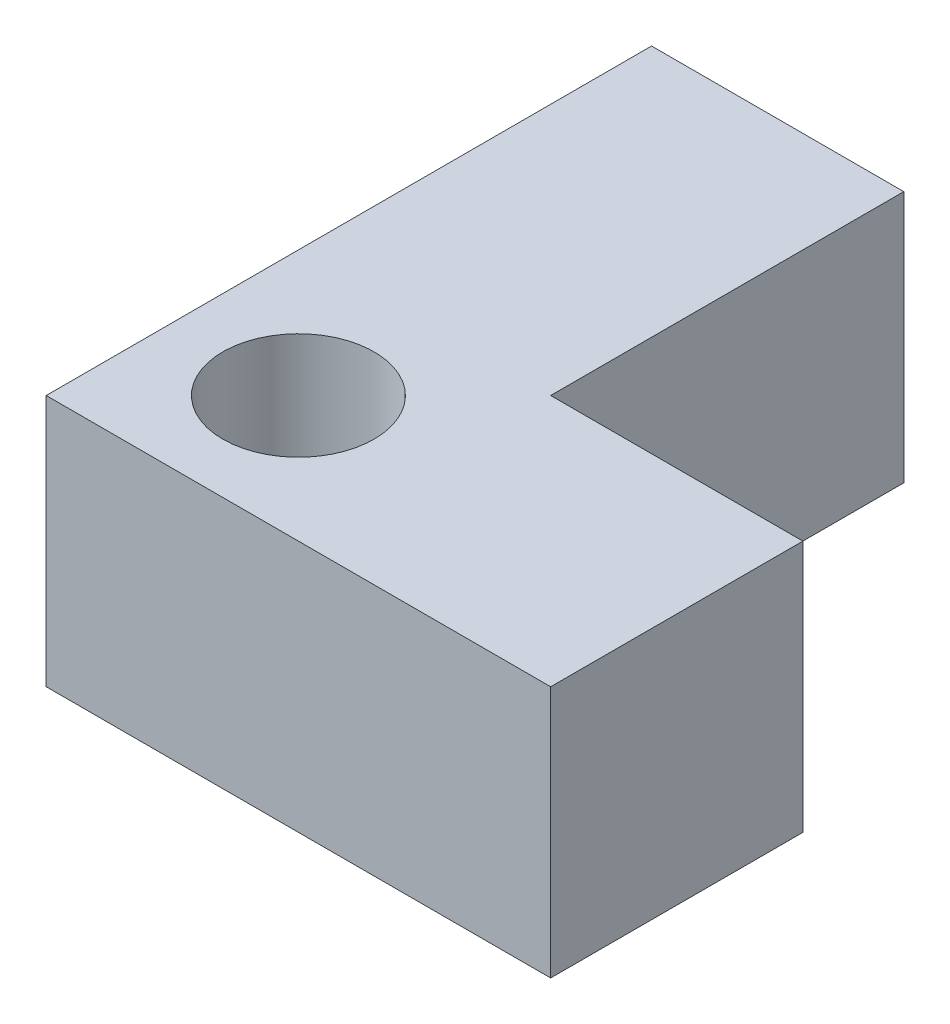
ISO-10303-21;
HEADER;
FILE_DESCRIPTION(('STEP AP214'),'2;1');
FILE_NAME('part.step','',(''),(''),'','','');
FILE_SCHEMA(('AUTOMOTIVE_DESIGN { 1 0 10303 214 1 1 1 1 }'));
ENDSEC;
DATA;
#1=APPLICATION_CONTEXT('core data for automotive mechanical design processes');
#2=APPLICATION_PROTOCOL_DEFINITION('international standard','automotive_design',2000,#1);
#3=PRODUCT_CONTEXT('',#1,'mechanical');
#4=PRODUCT('Part','Part','',(#3));
#5=PRODUCT_RELATED_PRODUCT_CATEGORY('part','',(#4));
#6=PRODUCT_DEFINITION_FORMATION('','',#4);
#7=PRODUCT_DEFINITION_CONTEXT('part definition',#1,'design');
#8=PRODUCT_DEFINITION('design','',#6,#7);
#9=PRODUCT_DEFINITION_SHAPE('','',#8);
#10=(LENGTH_UNIT() NAMED_UNIT(*) SI_UNIT(.MILLI.,.METRE.));
#11=(NAMED_UNIT(*) PLANE_ANGLE_UNIT() SI_UNIT($,.RADIAN.));
#12=(NAMED_UNIT(*) SI_UNIT($,.STERADIAN.) SOLID_ANGLE_UNIT());
#13=UNCERTAINTY_MEASURE_WITH_UNIT(LENGTH_MEASURE(1.E-05),#10,'distance_accuracy_value','');
#14=(GEOMETRIC_REPRESENTATION_CONTEXT(3) GLOBAL_UNCERTAINTY_ASSIGNED_CONTEXT((#13)) GLOBAL_UNIT_ASSIGNED_CONTEXT((#10,
#11,#12)) REPRESENTATION_CONTEXT('',''));
#15=CARTESIAN_POINT('',(0.,0.,0.));
#16=DIRECTION('',(0.,0.,1.));
#17=DIRECTION('',(1.,0.,0.));
#18=AXIS2_PLACEMENT_3D('',#15,#16,#17);
#19=CARTESIAN_POINT('',(0.,5.,-12.));
#20=DIRECTION('',(1.,0.,0.));
#21=DIRECTION('',(0.,0.,-1.));
#22=AXIS2_PLACEMENT_3D('',#19,#20,#21);
#23=PLANE('',#22);
#24=DIRECTION('',(0.,0.,1.));
#25=VECTOR('',#24,1.);
#26=CARTESIAN_POINT('',(0.,0.,-12.));
#27=LINE('',#26,#25);
#28=CARTESIAN_POINT('',(0.,0.,-12.));
#29=VERTEX_POINT('',#28);
#30=CARTESIAN_POINT('',(0.,0.,0.));
#31=VERTEX_POINT('',#30);
#32=EDGE_CURVE('E123',#29,#31,#27,.T.);
#33=ORIENTED_EDGE('',*,*,#32,.T.);
#34=DIRECTION('',(0.,-1.,0.));
#35=VECTOR('',#34,1.);
#36=CARTESIAN_POINT('',(0.,5.,0.));
#37=LINE('',#36,#35);
#38=CARTESIAN_POINT('',(0.,5.,0.));
#39=VERTEX_POINT('',#38);
#40=EDGE_CURVE('E11',#39,#31,#37,.T.);
#41=ORIENTED_EDGE('',*,*,#40,.F.);
#42=DIRECTION('',(0.,0.,1.));
#43=VECTOR('',#42,1.);
#44=CARTESIAN_POINT('',(0.,5.,-12.));
#45=LINE('',#44,#43);
#46=CARTESIAN_POINT('',(0.,5.,-12.));
#47=VERTEX_POINT('',#46);
#48=EDGE_CURVE('E134',#47,#39,#45,.T.);
#49=ORIENTED_EDGE('',*,*,#48,.F.);
#50=DIRECTION('',(0.,-1.,0.));
#51=VECTOR('',#50,1.);
#52=CARTESIAN_POINT('',(0.,5.,-12.));
#53=LINE('',#52,#51);
#54=EDGE_CURVE('E119',#47,#29,#53,.T.);
#55=ORIENTED_EDGE('',*,*,#54,.T.);
#56=EDGE_LOOP('',(#33,#41,#49,#55));
#57=FACE_BOUND('',#56,.T.);
#58=ADVANCED_FACE('F39',(#57),#23,.F.);
#59=CARTESIAN_POINT('',(0.,5.,0.));
#60=DIRECTION('',(0.,0.,-1.));
#61=DIRECTION('',(-1.,0.,0.));
#62=AXIS2_PLACEMENT_3D('',#59,#60,#61);
#63=PLANE('',#62);
#64=DIRECTION('',(1.,0.,0.));
#65=VECTOR('',#64,1.);
#66=CARTESIAN_POINT('',(0.,0.,0.));
#67=LINE('',#66,#65);
#68=CARTESIAN_POINT('',(10.,0.,0.));
#69=VERTEX_POINT('',#68);
#70=EDGE_CURVE('E126',#31,#69,#67,.T.);
#71=ORIENTED_EDGE('',*,*,#70,.T.);
#72=DIRECTION('',(0.,-1.,0.));
#73=VECTOR('',#72,1.);
#74=CARTESIAN_POINT('',(10.,5.,0.));
#75=LINE('',#74,#73);
#76=CARTESIAN_POINT('',(10.,5.,0.));
#77=VERTEX_POINT('',#76);
#78=EDGE_CURVE('E47',#77,#69,#75,.T.);
#79=ORIENTED_EDGE('',*,*,#78,.F.);
#80=DIRECTION('',(1.,0.,0.));
#81=VECTOR('',#80,1.);
#82=CARTESIAN_POINT('',(0.,5.,0.));
#83=LINE('',#82,#81);
#84=EDGE_CURVE('E92',#39,#77,#83,.T.);
#85=ORIENTED_EDGE('',*,*,#84,.F.);
#86=ORIENTED_EDGE('',*,*,#40,.T.);
#87=EDGE_LOOP('',(#71,#79,#85,#86));
#88=FACE_BOUND('',#87,.T.);
#89=ADVANCED_FACE('F159',(#88),#63,.F.);
#90=CARTESIAN_POINT('',(10.,5.,0.));
#91=DIRECTION('',(-1.,0.,0.));
#92=DIRECTION('',(0.,0.,1.));
#93=AXIS2_PLACEMENT_3D('',#90,#91,#92);
#94=PLANE('',#93);
#95=DIRECTION('',(0.,0.,-1.));
#96=VECTOR('',#95,1.);
#97=CARTESIAN_POINT('',(10.,0.,0.));
#98=LINE('',#97,#96);
#99=CARTESIAN_POINT('',(10.,0.,-5.));
#100=VERTEX_POINT('',#99);
#101=EDGE_CURVE('E129',#69,#100,#98,.T.);
#102=ORIENTED_EDGE('',*,*,#101,.T.);
#103=DIRECTION('',(0.,-1.,0.));
#104=VECTOR('',#103,1.);
#105=CARTESIAN_POINT('',(10.,5.,-5.));
#106=LINE('',#105,#104);
#107=CARTESIAN_POINT('',(10.,5.,-5.));
#108=VERTEX_POINT('',#107);
#109=EDGE_CURVE('E114',#108,#100,#106,.T.);
#110=ORIENTED_EDGE('',*,*,#109,.F.);
#111=DIRECTION('',(0.,0.,-1.));
#112=VECTOR('',#111,1.);
#113=CARTESIAN_POINT('',(10.,5.,0.));
#114=LINE('',#113,#112);
#115=EDGE_CURVE('E105',#77,#108,#114,.T.);
#116=ORIENTED_EDGE('',*,*,#115,.F.);
#117=ORIENTED_EDGE('',*,*,#78,.T.);
#118=EDGE_LOOP('',(#102,#110,#116,#117));
#119=FACE_BOUND('',#118,.T.);
#120=ADVANCED_FACE('F140',(#119),#94,.F.);
#121=CARTESIAN_POINT('',(10.,5.,-5.));
#122=DIRECTION('',(0.,0.,1.));
#123=DIRECTION('',(1.,0.,0.));
#124=AXIS2_PLACEMENT_3D('',#121,#122,#123);
#125=PLANE('',#124);
#126=DIRECTION('',(-1.,0.,0.));
#127=VECTOR('',#126,1.);
#128=CARTESIAN_POINT('',(10.,0.,-5.));
#129=LINE('',#128,#127);
#130=CARTESIAN_POINT('',(5.,0.,-5.));
#131=VERTEX_POINT('',#130);
#132=EDGE_CURVE('E113',#100,#131,#129,.T.);
#133=ORIENTED_EDGE('',*,*,#132,.T.);
#134=DIRECTION('',(0.,-1.,0.));
#135=VECTOR('',#134,1.);
#136=CARTESIAN_POINT('',(5.,5.,-5.));
#137=LINE('',#136,#135);
#138=CARTESIAN_POINT('',(5.,5.,-5.));
#139=VERTEX_POINT('',#138);
#140=EDGE_CURVE('E110',#139,#131,#137,.T.);
#141=ORIENTED_EDGE('',*,*,#140,.F.);
#142=DIRECTION('',(-1.,0.,0.));
#143=VECTOR('',#142,1.);
#144=CARTESIAN_POINT('',(10.,5.,-5.));
#145=LINE('',#144,#143);
#146=EDGE_CURVE('E99',#108,#139,#145,.T.);
#147=ORIENTED_EDGE('',*,*,#146,.F.);
#148=ORIENTED_EDGE('',*,*,#109,.T.);
#149=EDGE_LOOP('',(#133,#141,#147,#148));
#150=FACE_BOUND('',#149,.T.);
#151=ADVANCED_FACE('F111',(#150),#125,.F.);
#152=CARTESIAN_POINT('',(5.,5.,-5.));
#153=DIRECTION('',(-1.,0.,0.));
#154=DIRECTION('',(0.,0.,1.));
#155=AXIS2_PLACEMENT_3D('',#152,#153,#154);
#156=PLANE('',#155);
#157=DIRECTION('',(0.,0.,-1.));
#158=VECTOR('',#157,1.);
#159=CARTESIAN_POINT('',(5.,0.,-5.));
#160=LINE('',#159,#158);
#161=CARTESIAN_POINT('',(5.,0.,-12.));
#162=VERTEX_POINT('',#161);
#163=EDGE_CURVE('E78',#131,#162,#160,.T.);
#164=ORIENTED_EDGE('',*,*,#163,.T.);
#165=DIRECTION('',(0.,-1.,0.));
#166=VECTOR('',#165,1.);
#167=CARTESIAN_POINT('',(5.,5.,-12.));
#168=LINE('',#167,#166);
#169=CARTESIAN_POINT('',(5.,5.,-12.));
#170=VERTEX_POINT('',#169);
#171=EDGE_CURVE('E115',#170,#162,#168,.T.);
#172=ORIENTED_EDGE('',*,*,#171,.F.);
#173=DIRECTION('',(0.,0.,-1.));
#174=VECTOR('',#173,1.);
#175=CARTESIAN_POINT('',(5.,5.,-5.));
#176=LINE('',#175,#174);
#177=EDGE_CURVE('E103',#139,#170,#176,.T.);
#178=ORIENTED_EDGE('',*,*,#177,.F.);
#179=ORIENTED_EDGE('',*,*,#140,.T.);
#180=EDGE_LOOP('',(#164,#172,#178,#179));
#181=FACE_BOUND('',#180,.T.);
#182=ADVANCED_FACE('F117',(#181),#156,.F.);
#183=CARTESIAN_POINT('',(5.,5.,-12.));
#184=DIRECTION('',(0.,0.,1.));
#185=DIRECTION('',(1.,0.,0.));
#186=AXIS2_PLACEMENT_3D('',#183,#184,#185);
#187=PLANE('',#186);
#188=DIRECTION('',(-1.,0.,0.));
#189=VECTOR('',#188,1.);
#190=CARTESIAN_POINT('',(5.,0.,-12.));
#191=LINE('',#190,#189);
#192=EDGE_CURVE('E84',#162,#29,#191,.T.);
#193=ORIENTED_EDGE('',*,*,#192,.T.);
#194=ORIENTED_EDGE('',*,*,#54,.F.);
#195=DIRECTION('',(-1.,0.,0.));
#196=VECTOR('',#195,1.);
#197=CARTESIAN_POINT('',(5.,5.,-12.));
#198=LINE('',#197,#196);
#199=EDGE_CURVE('E55',#170,#47,#198,.T.);
#200=ORIENTED_EDGE('',*,*,#199,.F.);
#201=ORIENTED_EDGE('',*,*,#171,.T.);
#202=EDGE_LOOP('',(#193,#194,#200,#201));
#203=FACE_BOUND('',#202,.T.);
#204=ADVANCED_FACE('F147',(#203),#187,.F.);
#205=CARTESIAN_POINT('',(0.,5.,0.));
#206=DIRECTION('',(0.,1.,0.));
#207=DIRECTION('',(0.,0.,1.));
#208=AXIS2_PLACEMENT_3D('',#205,#206,#207);
#209=PLANE('',#208);
#210=CARTESIAN_POINT('',(2.5,5.,-2.5));
#211=DIRECTION('',(0.,1.,0.));
#212=DIRECTION('',(0.,0.,1.));
#213=AXIS2_PLACEMENT_3D('',#210,#211,#212);
#214=CIRCLE('',#213,1.5);
#215=CARTESIAN_POINT('',(2.5,5.,-1.));
#216=VERTEX_POINT('',#215);
#217=EDGE_CURVE('E215',#216,#216,#214,.T.);
#218=ORIENTED_EDGE('',*,*,#217,.F.);
#219=EDGE_LOOP('',(#218));
#220=FACE_BOUND('',#219,.T.);
#221=ORIENTED_EDGE('',*,*,#48,.T.);
#222=ORIENTED_EDGE('',*,*,#84,.T.);
#223=ORIENTED_EDGE('',*,*,#115,.T.);
#224=ORIENTED_EDGE('',*,*,#146,.T.);
#225=ORIENTED_EDGE('',*,*,#177,.T.);
#226=ORIENTED_EDGE('',*,*,#199,.T.);
#227=EDGE_LOOP('',(#221,#222,#223,#224,#225,#226));
#228=FACE_BOUND('',#227,.T.);
#229=ADVANCED_FACE('F101',(#220,#228),#209,.T.);
#230=CARTESIAN_POINT('',(0.,0.,0.));
#231=DIRECTION('',(0.,1.,0.));
#232=DIRECTION('',(0.,0.,1.));
#233=AXIS2_PLACEMENT_3D('',#230,#231,#232);
#234=PLANE('',#233);
#235=CARTESIAN_POINT('',(2.5,0.,-2.5));
#236=DIRECTION('',(0.,1.,0.));
#237=DIRECTION('',(0.,0.,1.));
#238=AXIS2_PLACEMENT_3D('',#235,#236,#237);
#239=CIRCLE('',#238,1.5);
#240=CARTESIAN_POINT('',(2.5,0.,-1.));
#241=VERTEX_POINT('',#240);
#242=EDGE_CURVE('E127',#241,#241,#239,.T.);
#243=ORIENTED_EDGE('',*,*,#242,.T.);
#244=EDGE_LOOP('',(#243));
#245=FACE_BOUND('',#244,.T.);
#246=ORIENTED_EDGE('',*,*,#32,.F.);
#247=ORIENTED_EDGE('',*,*,#192,.F.);
#248=ORIENTED_EDGE('',*,*,#163,.F.);
#249=ORIENTED_EDGE('',*,*,#132,.F.);
#250=ORIENTED_EDGE('',*,*,#101,.F.);
#251=ORIENTED_EDGE('',*,*,#70,.F.);
#252=EDGE_LOOP('',(#246,#247,#248,#249,#250,#251));
#253=FACE_BOUND('',#252,.T.);
#254=ADVANCED_FACE('F143',(#245,#253),#234,.F.);
#255=CARTESIAN_POINT('',(2.5,0.,-2.5));
#256=DIRECTION('',(0.,1.,0.));
#257=DIRECTION('',(0.,0.,1.));
#258=AXIS2_PLACEMENT_3D('',#255,#256,#257);
#259=CYLINDRICAL_SURFACE('',#258,1.5);
#260=ORIENTED_EDGE('',*,*,#242,.F.);
#261=EDGE_LOOP('',(#260));
#262=FACE_BOUND('',#261,.T.);
#263=ORIENTED_EDGE('',*,*,#217,.T.);
#264=EDGE_LOOP('',(#263));
#265=FACE_BOUND('',#264,.T.);
#266=ADVANCED_FACE('F198',(#262,#265),#259,.F.);
#267=CLOSED_SHELL('',(#58,#89,#120,#151,#182,#204,#229,#254,#266));
#268=MANIFOLD_SOLID_BREP('B2',#267);
#269=ADVANCED_BREP_SHAPE_REPRESENTATION('',(#18,#268),#14);
#270=SHAPE_DEFINITION_REPRESENTATION(#9,#269);
ENDSEC;
END-ISO-10303-21;
